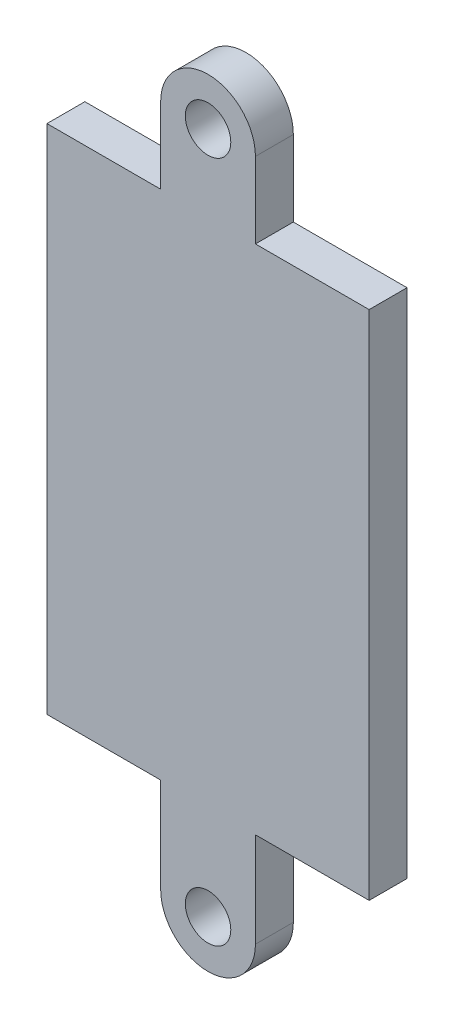
ISO-10303-21;
HEADER;
FILE_DESCRIPTION(('STEP AP214'),'2;1');
FILE_NAME('part.step','',(''),(''),'','','');
FILE_SCHEMA(('AUTOMOTIVE_DESIGN { 1 0 10303 214 1 1 1 1 }'));
ENDSEC;
DATA;
#1=APPLICATION_CONTEXT('core data for automotive mechanical design processes');
#2=APPLICATION_PROTOCOL_DEFINITION('international standard','automotive_design',2000,#1);
#3=PRODUCT_CONTEXT('',#1,'mechanical');
#4=PRODUCT('Part','Part','',(#3));
#5=PRODUCT_RELATED_PRODUCT_CATEGORY('part','',(#4));
#6=PRODUCT_DEFINITION_FORMATION('','',#4);
#7=PRODUCT_DEFINITION_CONTEXT('part definition',#1,'design');
#8=PRODUCT_DEFINITION('design','',#6,#7);
#9=PRODUCT_DEFINITION_SHAPE('','',#8);
#10=(LENGTH_UNIT() NAMED_UNIT(*) SI_UNIT(.MILLI.,.METRE.));
#11=(NAMED_UNIT(*) PLANE_ANGLE_UNIT() SI_UNIT($,.RADIAN.));
#12=(NAMED_UNIT(*) SI_UNIT($,.STERADIAN.) SOLID_ANGLE_UNIT());
#13=UNCERTAINTY_MEASURE_WITH_UNIT(LENGTH_MEASURE(1.E-05),#10,'distance_accuracy_value','');
#14=(GEOMETRIC_REPRESENTATION_CONTEXT(3) GLOBAL_UNCERTAINTY_ASSIGNED_CONTEXT((#13)) GLOBAL_UNIT_ASSIGNED_CONTEXT((#10,
#11,#12)) REPRESENTATION_CONTEXT('',''));
#15=CARTESIAN_POINT('',(0.,0.,0.));
#16=DIRECTION('',(0.,0.,1.));
#17=DIRECTION('',(1.,0.,0.));
#18=AXIS2_PLACEMENT_3D('',#15,#16,#17);
#19=CARTESIAN_POINT('',(10.7949999999999,39.37,2.54));
#20=DIRECTION('',(0.,0.,-1.));
#21=DIRECTION('',(-1.,0.,0.));
#22=AXIS2_PLACEMENT_3D('',#19,#20,#21);
#23=CYLINDRICAL_SURFACE('',#22,3.175);
#24=CARTESIAN_POINT('',(10.7949999999999,39.37,0.));
#25=DIRECTION('',(0.,0.,1.));
#26=DIRECTION('',(1.,0.,0.));
#27=AXIS2_PLACEMENT_3D('',#24,#25,#26);
#28=CIRCLE('',#27,3.175);
#29=CARTESIAN_POINT('',(13.9699999999999,39.37,0.));
#30=VERTEX_POINT('',#29);
#31=CARTESIAN_POINT('',(7.61999999999986,39.37,0.));
#32=VERTEX_POINT('',#31);
#33=EDGE_CURVE('E243',#30,#32,#28,.T.);
#34=ORIENTED_EDGE('',*,*,#33,.T.);
#35=DIRECTION('',(0.,0.,-1.));
#36=VECTOR('',#35,1.);
#37=CARTESIAN_POINT('',(7.61999999999986,39.37,2.54));
#38=LINE('',#37,#36);
#39=CARTESIAN_POINT('',(7.61999999999986,39.37,2.54));
#40=VERTEX_POINT('',#39);
#41=EDGE_CURVE('E11',#40,#32,#38,.T.);
#42=ORIENTED_EDGE('',*,*,#41,.F.);
#43=CARTESIAN_POINT('',(10.7949999999999,39.37,2.54));
#44=DIRECTION('',(0.,0.,1.));
#45=DIRECTION('',(1.,0.,0.));
#46=AXIS2_PLACEMENT_3D('',#43,#44,#45);
#47=CIRCLE('',#46,3.175);
#48=CARTESIAN_POINT('',(13.9699999999999,39.37,2.54));
#49=VERTEX_POINT('',#48);
#50=EDGE_CURVE('E184',#49,#40,#47,.T.);
#51=ORIENTED_EDGE('',*,*,#50,.F.);
#52=DIRECTION('',(0.,0.,-1.));
#53=VECTOR('',#52,1.);
#54=CARTESIAN_POINT('',(13.9699999999999,39.37,2.54));
#55=LINE('',#54,#53);
#56=EDGE_CURVE('E63',#49,#30,#55,.T.);
#57=ORIENTED_EDGE('',*,*,#56,.T.);
#58=EDGE_LOOP('',(#34,#42,#51,#57));
#59=FACE_BOUND('',#58,.T.);
#60=ADVANCED_FACE('F45',(#59),#23,.T.);
#61=CARTESIAN_POINT('',(7.61999999999986,0.,2.54));
#62=DIRECTION('',(1.,0.,0.));
#63=DIRECTION('',(0.,0.,-1.));
#64=AXIS2_PLACEMENT_3D('',#61,#62,#63);
#65=PLANE('',#64);
#66=DIRECTION('',(0.,-1.,0.));
#67=VECTOR('',#66,1.);
#68=CARTESIAN_POINT('',(7.61999999999986,0.,0.));
#69=LINE('',#68,#67);
#70=CARTESIAN_POINT('',(7.61999999999986,34.29,0.));
#71=VERTEX_POINT('',#70);
#72=EDGE_CURVE('E238',#32,#71,#69,.T.);
#73=ORIENTED_EDGE('',*,*,#72,.T.);
#74=DIRECTION('',(0.,0.,-1.));
#75=VECTOR('',#74,1.);
#76=CARTESIAN_POINT('',(7.61999999999986,34.29,2.54));
#77=LINE('',#76,#75);
#78=CARTESIAN_POINT('',(7.61999999999986,34.29,2.54));
#79=VERTEX_POINT('',#78);
#80=EDGE_CURVE('E55',#79,#71,#77,.T.);
#81=ORIENTED_EDGE('',*,*,#80,.F.);
#82=DIRECTION('',(0.,-1.,0.));
#83=VECTOR('',#82,1.);
#84=CARTESIAN_POINT('',(7.61999999999986,0.,2.54));
#85=LINE('',#84,#83);
#86=EDGE_CURVE('E113',#40,#79,#85,.T.);
#87=ORIENTED_EDGE('',*,*,#86,.F.);
#88=ORIENTED_EDGE('',*,*,#41,.T.);
#89=EDGE_LOOP('',(#73,#81,#87,#88));
#90=FACE_BOUND('',#89,.T.);
#91=ADVANCED_FACE('F239',(#90),#65,.F.);
#92=CARTESIAN_POINT('',(0.,34.29,2.54));
#93=DIRECTION('',(0.,1.,0.));
#94=DIRECTION('',(0.,0.,1.));
#95=AXIS2_PLACEMENT_3D('',#92,#93,#94);
#96=PLANE('',#95);
#97=DIRECTION('',(1.,0.,0.));
#98=VECTOR('',#97,1.);
#99=CARTESIAN_POINT('',(0.,34.29,0.));
#100=LINE('',#99,#98);
#101=CARTESIAN_POINT('',(0.,34.29,0.));
#102=VERTEX_POINT('',#101);
#103=EDGE_CURVE('E236',#102,#71,#100,.T.);
#104=ORIENTED_EDGE('',*,*,#103,.F.);
#105=DIRECTION('',(0.,0.,-1.));
#106=VECTOR('',#105,1.);
#107=CARTESIAN_POINT('',(0.,34.29,2.54));
#108=LINE('',#107,#106);
#109=CARTESIAN_POINT('',(0.,34.29,2.54));
#110=VERTEX_POINT('',#109);
#111=EDGE_CURVE('E229',#110,#102,#108,.T.);
#112=ORIENTED_EDGE('',*,*,#111,.F.);
#113=DIRECTION('',(1.,0.,0.));
#114=VECTOR('',#113,1.);
#115=CARTESIAN_POINT('',(0.,34.29,2.54));
#116=LINE('',#115,#114);
#117=EDGE_CURVE('E169',#110,#79,#116,.T.);
#118=ORIENTED_EDGE('',*,*,#117,.T.);
#119=ORIENTED_EDGE('',*,*,#80,.T.);
#120=EDGE_LOOP('',(#104,#112,#118,#119));
#121=FACE_BOUND('',#120,.T.);
#122=ADVANCED_FACE('F234',(#121),#96,.T.);
#123=CARTESIAN_POINT('',(0.,0.,2.54));
#124=DIRECTION('',(-1.,0.,0.));
#125=DIRECTION('',(0.,0.,1.));
#126=AXIS2_PLACEMENT_3D('',#123,#124,#125);
#127=PLANE('',#126);
#128=DIRECTION('',(0.,1.,0.));
#129=VECTOR('',#128,1.);
#130=CARTESIAN_POINT('',(0.,0.,0.));
#131=LINE('',#130,#129);
#132=CARTESIAN_POINT('',(0.,0.,0.));
#133=VERTEX_POINT('',#132);
#134=EDGE_CURVE('E248',#133,#102,#131,.T.);
#135=ORIENTED_EDGE('',*,*,#134,.F.);
#136=DIRECTION('',(0.,0.,-1.));
#137=VECTOR('',#136,1.);
#138=CARTESIAN_POINT('',(0.,0.,2.54));
#139=LINE('',#138,#137);
#140=CARTESIAN_POINT('',(0.,0.,2.54));
#141=VERTEX_POINT('',#140);
#142=EDGE_CURVE('E226',#141,#133,#139,.T.);
#143=ORIENTED_EDGE('',*,*,#142,.F.);
#144=DIRECTION('',(0.,1.,0.));
#145=VECTOR('',#144,1.);
#146=CARTESIAN_POINT('',(0.,0.,2.54));
#147=LINE('',#146,#145);
#148=EDGE_CURVE('E177',#141,#110,#147,.T.);
#149=ORIENTED_EDGE('',*,*,#148,.T.);
#150=ORIENTED_EDGE('',*,*,#111,.T.);
#151=EDGE_LOOP('',(#135,#143,#149,#150));
#152=FACE_BOUND('',#151,.T.);
#153=ADVANCED_FACE('F319',(#152),#127,.T.);
#154=CARTESIAN_POINT('',(0.,0.,2.54));
#155=DIRECTION('',(0.,1.,0.));
#156=DIRECTION('',(0.,0.,1.));
#157=AXIS2_PLACEMENT_3D('',#154,#155,#156);
#158=PLANE('',#157);
#159=DIRECTION('',(1.,0.,0.));
#160=VECTOR('',#159,1.);
#161=CARTESIAN_POINT('',(0.,0.,0.));
#162=LINE('',#161,#160);
#163=CARTESIAN_POINT('',(7.61999999999995,0.,0.));
#164=VERTEX_POINT('',#163);
#165=EDGE_CURVE('E252',#133,#164,#162,.T.);
#166=ORIENTED_EDGE('',*,*,#165,.T.);
#167=DIRECTION('',(0.,0.,-1.));
#168=VECTOR('',#167,1.);
#169=CARTESIAN_POINT('',(7.61999999999995,0.,2.54));
#170=LINE('',#169,#168);
#171=CARTESIAN_POINT('',(7.61999999999995,0.,2.54));
#172=VERTEX_POINT('',#171);
#173=EDGE_CURVE('E223',#172,#164,#170,.T.);
#174=ORIENTED_EDGE('',*,*,#173,.F.);
#175=DIRECTION('',(1.,0.,0.));
#176=VECTOR('',#175,1.);
#177=CARTESIAN_POINT('',(0.,0.,2.54));
#178=LINE('',#177,#176);
#179=EDGE_CURVE('E183',#141,#172,#178,.T.);
#180=ORIENTED_EDGE('',*,*,#179,.F.);
#181=ORIENTED_EDGE('',*,*,#142,.T.);
#182=EDGE_LOOP('',(#166,#174,#180,#181));
#183=FACE_BOUND('',#182,.T.);
#184=ADVANCED_FACE('F273',(#183),#158,.F.);
#185=CARTESIAN_POINT('',(7.61999999999986,2.13370987545143E-13,2.54));
#186=DIRECTION('',(-1.,0.,0.));
#187=DIRECTION('',(0.,-1.,0.));
#188=AXIS2_PLACEMENT_3D('',#185,#186,#187);
#189=PLANE('',#188);
#190=DIRECTION('',(0.,1.,0.));
#191=VECTOR('',#190,1.);
#192=CARTESIAN_POINT('',(7.61999999999986,2.13370987545143E-13,0.));
#193=LINE('',#192,#191);
#194=CARTESIAN_POINT('',(7.62000000000004,-6.35,0.));
#195=VERTEX_POINT('',#194);
#196=EDGE_CURVE('E266',#195,#164,#193,.T.);
#197=ORIENTED_EDGE('',*,*,#196,.F.);
#198=DIRECTION('',(0.,0.,-1.));
#199=VECTOR('',#198,1.);
#200=CARTESIAN_POINT('',(7.62000000000004,-6.35,2.54));
#201=LINE('',#200,#199);
#202=CARTESIAN_POINT('',(7.62000000000004,-6.35,2.54));
#203=VERTEX_POINT('',#202);
#204=EDGE_CURVE('E220',#203,#195,#201,.T.);
#205=ORIENTED_EDGE('',*,*,#204,.F.);
#206=DIRECTION('',(0.,1.,0.));
#207=VECTOR('',#206,1.);
#208=CARTESIAN_POINT('',(7.61999999999986,2.13370987545143E-13,2.54));
#209=LINE('',#208,#207);
#210=EDGE_CURVE('E283',#203,#172,#209,.T.);
#211=ORIENTED_EDGE('',*,*,#210,.T.);
#212=ORIENTED_EDGE('',*,*,#173,.T.);
#213=EDGE_LOOP('',(#197,#205,#211,#212));
#214=FACE_BOUND('',#213,.T.);
#215=ADVANCED_FACE('F280',(#214),#189,.T.);
#216=CARTESIAN_POINT('',(10.795,-6.35,2.54));
#217=DIRECTION('',(0.,0.,-1.));
#218=DIRECTION('',(-1.,0.,0.));
#219=AXIS2_PLACEMENT_3D('',#216,#217,#218);
#220=CYLINDRICAL_SURFACE('',#219,3.17499999999998);
#221=CARTESIAN_POINT('',(10.795,-6.35,0.));
#222=DIRECTION('',(0.,0.,1.));
#223=DIRECTION('',(1.,0.,0.));
#224=AXIS2_PLACEMENT_3D('',#221,#222,#223);
#225=CIRCLE('',#224,3.17499999999998);
#226=CARTESIAN_POINT('',(13.97,-6.35,0.));
#227=VERTEX_POINT('',#226);
#228=EDGE_CURVE('E263',#195,#227,#225,.T.);
#229=ORIENTED_EDGE('',*,*,#228,.T.);
#230=DIRECTION('',(0.,0.,-1.));
#231=VECTOR('',#230,1.);
#232=CARTESIAN_POINT('',(13.97,-6.35,2.54));
#233=LINE('',#232,#231);
#234=CARTESIAN_POINT('',(13.97,-6.35,2.54));
#235=VERTEX_POINT('',#234);
#236=EDGE_CURVE('E216',#235,#227,#233,.T.);
#237=ORIENTED_EDGE('',*,*,#236,.F.);
#238=CARTESIAN_POINT('',(10.795,-6.35,2.54));
#239=DIRECTION('',(0.,0.,1.));
#240=DIRECTION('',(1.,0.,0.));
#241=AXIS2_PLACEMENT_3D('',#238,#239,#240);
#242=CIRCLE('',#241,3.17499999999998);
#243=EDGE_CURVE('E285',#203,#235,#242,.T.);
#244=ORIENTED_EDGE('',*,*,#243,.F.);
#245=ORIENTED_EDGE('',*,*,#204,.T.);
#246=EDGE_LOOP('',(#229,#237,#244,#245));
#247=FACE_BOUND('',#246,.T.);
#248=ADVANCED_FACE('F325',(#247),#220,.T.);
#249=CARTESIAN_POINT('',(13.9699999999999,2.8622937353617E-13,2.54));
#250=DIRECTION('',(-1.,0.,0.));
#251=DIRECTION('',(0.,-1.,0.));
#252=AXIS2_PLACEMENT_3D('',#249,#250,#251);
#253=PLANE('',#252);
#254=DIRECTION('',(0.,1.,0.));
#255=VECTOR('',#254,1.);
#256=CARTESIAN_POINT('',(13.9699999999999,2.8622937353617E-13,0.));
#257=LINE('',#256,#255);
#258=CARTESIAN_POINT('',(13.9699999999999,0.,0.));
#259=VERTEX_POINT('',#258);
#260=EDGE_CURVE('E258',#227,#259,#257,.T.);
#261=ORIENTED_EDGE('',*,*,#260,.T.);
#262=DIRECTION('',(0.,0.,-1.));
#263=VECTOR('',#262,1.);
#264=CARTESIAN_POINT('',(13.9699999999999,0.,2.54));
#265=LINE('',#264,#263);
#266=CARTESIAN_POINT('',(13.9699999999999,0.,2.54));
#267=VERTEX_POINT('',#266);
#268=EDGE_CURVE('E212',#267,#259,#265,.T.);
#269=ORIENTED_EDGE('',*,*,#268,.F.);
#270=DIRECTION('',(0.,1.,0.));
#271=VECTOR('',#270,1.);
#272=CARTESIAN_POINT('',(13.9699999999999,2.8622937353617E-13,2.54));
#273=LINE('',#272,#271);
#274=EDGE_CURVE('E289',#235,#267,#273,.T.);
#275=ORIENTED_EDGE('',*,*,#274,.F.);
#276=ORIENTED_EDGE('',*,*,#236,.T.);
#277=EDGE_LOOP('',(#261,#269,#275,#276));
#278=FACE_BOUND('',#277,.T.);
#279=ADVANCED_FACE('F328',(#278),#253,.F.);
#280=CARTESIAN_POINT('',(21.59,0.,0.));
#281=VERTEX_POINT('',#280);
#282=EDGE_CURVE('E256',#259,#281,#162,.T.);
#283=ORIENTED_EDGE('',*,*,#282,.T.);
#284=DIRECTION('',(0.,0.,-1.));
#285=VECTOR('',#284,1.);
#286=CARTESIAN_POINT('',(21.59,0.,2.54));
#287=LINE('',#286,#285);
#288=CARTESIAN_POINT('',(21.59,0.,2.54));
#289=VERTEX_POINT('',#288);
#290=EDGE_CURVE('E163',#289,#281,#287,.T.);
#291=ORIENTED_EDGE('',*,*,#290,.F.);
#292=EDGE_CURVE('E149',#267,#289,#178,.T.);
#293=ORIENTED_EDGE('',*,*,#292,.F.);
#294=ORIENTED_EDGE('',*,*,#268,.T.);
#295=EDGE_LOOP('',(#283,#291,#293,#294));
#296=FACE_BOUND('',#295,.T.);
#297=ADVANCED_FACE('F332',(#296),#158,.F.);
#298=CARTESIAN_POINT('',(21.59,0.,2.54));
#299=DIRECTION('',(-1.,0.,0.));
#300=DIRECTION('',(0.,0.,1.));
#301=AXIS2_PLACEMENT_3D('',#298,#299,#300);
#302=PLANE('',#301);
#303=DIRECTION('',(0.,1.,0.));
#304=VECTOR('',#303,1.);
#305=CARTESIAN_POINT('',(21.59,0.,0.));
#306=LINE('',#305,#304);
#307=CARTESIAN_POINT('',(21.59,34.29,0.));
#308=VERTEX_POINT('',#307);
#309=EDGE_CURVE('E159',#281,#308,#306,.T.);
#310=ORIENTED_EDGE('',*,*,#309,.T.);
#311=DIRECTION('',(0.,0.,-1.));
#312=VECTOR('',#311,1.);
#313=CARTESIAN_POINT('',(21.59,34.29,2.54));
#314=LINE('',#313,#312);
#315=CARTESIAN_POINT('',(21.59,34.29,2.54));
#316=VERTEX_POINT('',#315);
#317=EDGE_CURVE('E156',#316,#308,#314,.T.);
#318=ORIENTED_EDGE('',*,*,#317,.F.);
#319=DIRECTION('',(0.,1.,0.));
#320=VECTOR('',#319,1.);
#321=CARTESIAN_POINT('',(21.59,0.,2.54));
#322=LINE('',#321,#320);
#323=EDGE_CURVE('E141',#289,#316,#322,.T.);
#324=ORIENTED_EDGE('',*,*,#323,.F.);
#325=ORIENTED_EDGE('',*,*,#290,.T.);
#326=EDGE_LOOP('',(#310,#318,#324,#325));
#327=FACE_BOUND('',#326,.T.);
#328=ADVANCED_FACE('F157',(#327),#302,.F.);
#329=CARTESIAN_POINT('',(13.9699999999999,34.29,0.));
#330=VERTEX_POINT('',#329);
#331=EDGE_CURVE('E202',#330,#308,#100,.T.);
#332=ORIENTED_EDGE('',*,*,#331,.F.);
#333=DIRECTION('',(0.,0.,-1.));
#334=VECTOR('',#333,1.);
#335=CARTESIAN_POINT('',(13.9699999999999,34.29,2.54));
#336=LINE('',#335,#334);
#337=CARTESIAN_POINT('',(13.9699999999999,34.29,2.54));
#338=VERTEX_POINT('',#337);
#339=EDGE_CURVE('E101',#338,#330,#336,.T.);
#340=ORIENTED_EDGE('',*,*,#339,.F.);
#341=EDGE_CURVE('E147',#338,#316,#116,.T.);
#342=ORIENTED_EDGE('',*,*,#341,.T.);
#343=ORIENTED_EDGE('',*,*,#317,.T.);
#344=EDGE_LOOP('',(#332,#340,#342,#343));
#345=FACE_BOUND('',#344,.T.);
#346=ADVANCED_FACE('F165',(#345),#96,.T.);
#347=CARTESIAN_POINT('',(13.9699999999999,0.,2.54));
#348=DIRECTION('',(1.,0.,0.));
#349=DIRECTION('',(0.,0.,-1.));
#350=AXIS2_PLACEMENT_3D('',#347,#348,#349);
#351=PLANE('',#350);
#352=DIRECTION('',(0.,-1.,0.));
#353=VECTOR('',#352,1.);
#354=CARTESIAN_POINT('',(13.9699999999999,0.,0.));
#355=LINE('',#354,#353);
#356=EDGE_CURVE('E196',#30,#330,#355,.T.);
#357=ORIENTED_EDGE('',*,*,#356,.F.);
#358=ORIENTED_EDGE('',*,*,#56,.F.);
#359=DIRECTION('',(0.,-1.,0.));
#360=VECTOR('',#359,1.);
#361=CARTESIAN_POINT('',(13.9699999999999,0.,2.54));
#362=LINE('',#361,#360);
#363=EDGE_CURVE('E167',#49,#338,#362,.T.);
#364=ORIENTED_EDGE('',*,*,#363,.T.);
#365=ORIENTED_EDGE('',*,*,#339,.T.);
#366=EDGE_LOOP('',(#357,#358,#364,#365));
#367=FACE_BOUND('',#366,.T.);
#368=ADVANCED_FACE('F303',(#367),#351,.T.);
#369=CARTESIAN_POINT('',(10.7949999999999,39.37,2.54));
#370=DIRECTION('',(0.,0.,-1.));
#371=DIRECTION('',(-1.,0.,0.));
#372=AXIS2_PLACEMENT_3D('',#369,#370,#371);
#373=CYLINDRICAL_SURFACE('',#372,1.524);
#374=CARTESIAN_POINT('',(10.7949999999999,39.37,2.54));
#375=DIRECTION('',(0.,0.,1.));
#376=DIRECTION('',(1.,0.,0.));
#377=AXIS2_PLACEMENT_3D('',#374,#375,#376);
#378=CIRCLE('',#377,1.524);
#379=CARTESIAN_POINT('',(12.3189999999999,39.37,2.54));
#380=VERTEX_POINT('',#379);
#381=EDGE_CURVE('E186',#380,#380,#378,.T.);
#382=ORIENTED_EDGE('',*,*,#381,.T.);
#383=EDGE_LOOP('',(#382));
#384=FACE_BOUND('',#383,.T.);
#385=CARTESIAN_POINT('',(10.7949999999999,39.37,0.));
#386=DIRECTION('',(0.,0.,1.));
#387=DIRECTION('',(1.,0.,0.));
#388=AXIS2_PLACEMENT_3D('',#385,#386,#387);
#389=CIRCLE('',#388,1.524);
#390=CARTESIAN_POINT('',(12.3189999999999,39.37,0.));
#391=VERTEX_POINT('',#390);
#392=EDGE_CURVE('E298',#391,#391,#389,.T.);
#393=ORIENTED_EDGE('',*,*,#392,.F.);
#394=EDGE_LOOP('',(#393));
#395=FACE_BOUND('',#394,.T.);
#396=ADVANCED_FACE('F47',(#384,#395),#373,.F.);
#397=CARTESIAN_POINT('',(10.795,-6.35,2.54));
#398=DIRECTION('',(0.,0.,-1.));
#399=DIRECTION('',(-1.,0.,0.));
#400=AXIS2_PLACEMENT_3D('',#397,#398,#399);
#401=CYLINDRICAL_SURFACE('',#400,1.524);
#402=CARTESIAN_POINT('',(10.795,-6.35,2.54));
#403=DIRECTION('',(0.,0.,1.));
#404=DIRECTION('',(1.,0.,0.));
#405=AXIS2_PLACEMENT_3D('',#402,#403,#404);
#406=CIRCLE('',#405,1.524);
#407=CARTESIAN_POINT('',(12.319,-6.35,2.54));
#408=VERTEX_POINT('',#407);
#409=EDGE_CURVE('E171',#408,#408,#406,.T.);
#410=ORIENTED_EDGE('',*,*,#409,.T.);
#411=EDGE_LOOP('',(#410));
#412=FACE_BOUND('',#411,.T.);
#413=CARTESIAN_POINT('',(10.795,-6.35,0.));
#414=DIRECTION('',(0.,0.,1.));
#415=DIRECTION('',(1.,0.,0.));
#416=AXIS2_PLACEMENT_3D('',#413,#414,#415);
#417=CIRCLE('',#416,1.524);
#418=CARTESIAN_POINT('',(12.319,-6.35,0.));
#419=VERTEX_POINT('',#418);
#420=EDGE_CURVE('E191',#419,#419,#417,.T.);
#421=ORIENTED_EDGE('',*,*,#420,.F.);
#422=EDGE_LOOP('',(#421));
#423=FACE_BOUND('',#422,.T.);
#424=ADVANCED_FACE('F310',(#412,#423),#401,.F.);
#425=CARTESIAN_POINT('',(0.,0.,2.54));
#426=DIRECTION('',(0.,0.,1.));
#427=DIRECTION('',(1.,0.,0.));
#428=AXIS2_PLACEMENT_3D('',#425,#426,#427);
#429=PLANE('',#428);
#430=ORIENTED_EDGE('',*,*,#381,.F.);
#431=EDGE_LOOP('',(#430));
#432=FACE_BOUND('',#431,.T.);
#433=ORIENTED_EDGE('',*,*,#50,.T.);
#434=ORIENTED_EDGE('',*,*,#86,.T.);
#435=ORIENTED_EDGE('',*,*,#117,.F.);
#436=ORIENTED_EDGE('',*,*,#148,.F.);
#437=ORIENTED_EDGE('',*,*,#179,.T.);
#438=ORIENTED_EDGE('',*,*,#210,.F.);
#439=ORIENTED_EDGE('',*,*,#243,.T.);
#440=ORIENTED_EDGE('',*,*,#274,.T.);
#441=ORIENTED_EDGE('',*,*,#292,.T.);
#442=ORIENTED_EDGE('',*,*,#323,.T.);
#443=ORIENTED_EDGE('',*,*,#341,.F.);
#444=ORIENTED_EDGE('',*,*,#363,.F.);
#445=EDGE_LOOP('',(#433,#434,#435,#436,#437,#438,#439,#440,#441,#442,#443,#444));
#446=FACE_BOUND('',#445,.T.);
#447=ORIENTED_EDGE('',*,*,#409,.F.);
#448=EDGE_LOOP('',(#447));
#449=FACE_BOUND('',#448,.T.);
#450=ADVANCED_FACE('F143',(#432,#446,#449),#429,.T.);
#451=CARTESIAN_POINT('',(0.,0.,0.));
#452=DIRECTION('',(0.,0.,1.));
#453=DIRECTION('',(1.,0.,0.));
#454=AXIS2_PLACEMENT_3D('',#451,#452,#453);
#455=PLANE('',#454);
#456=ORIENTED_EDGE('',*,*,#392,.T.);
#457=EDGE_LOOP('',(#456));
#458=FACE_BOUND('',#457,.T.);
#459=ORIENTED_EDGE('',*,*,#33,.F.);
#460=ORIENTED_EDGE('',*,*,#356,.T.);
#461=ORIENTED_EDGE('',*,*,#331,.T.);
#462=ORIENTED_EDGE('',*,*,#309,.F.);
#463=ORIENTED_EDGE('',*,*,#282,.F.);
#464=ORIENTED_EDGE('',*,*,#260,.F.);
#465=ORIENTED_EDGE('',*,*,#228,.F.);
#466=ORIENTED_EDGE('',*,*,#196,.T.);
#467=ORIENTED_EDGE('',*,*,#165,.F.);
#468=ORIENTED_EDGE('',*,*,#134,.T.);
#469=ORIENTED_EDGE('',*,*,#103,.T.);
#470=ORIENTED_EDGE('',*,*,#72,.F.);
#471=EDGE_LOOP('',(#459,#460,#461,#462,#463,#464,#465,#466,#467,#468,#469,#470));
#472=FACE_BOUND('',#471,.T.);
#473=ORIENTED_EDGE('',*,*,#420,.T.);
#474=EDGE_LOOP('',(#473));
#475=FACE_BOUND('',#474,.T.);
#476=ADVANCED_FACE('F245',(#458,#472,#475),#455,.F.);
#477=CLOSED_SHELL('',(#60,#91,#122,#153,#184,#215,#248,#279,#297,#328,#346,#368,#396,#424,#450,#476));
#478=MANIFOLD_SOLID_BREP('B2',#477);
#479=ADVANCED_BREP_SHAPE_REPRESENTATION('',(#18,#478),#14);
#480=SHAPE_DEFINITION_REPRESENTATION(#9,#479);
ENDSEC;
END-ISO-10303-21;
